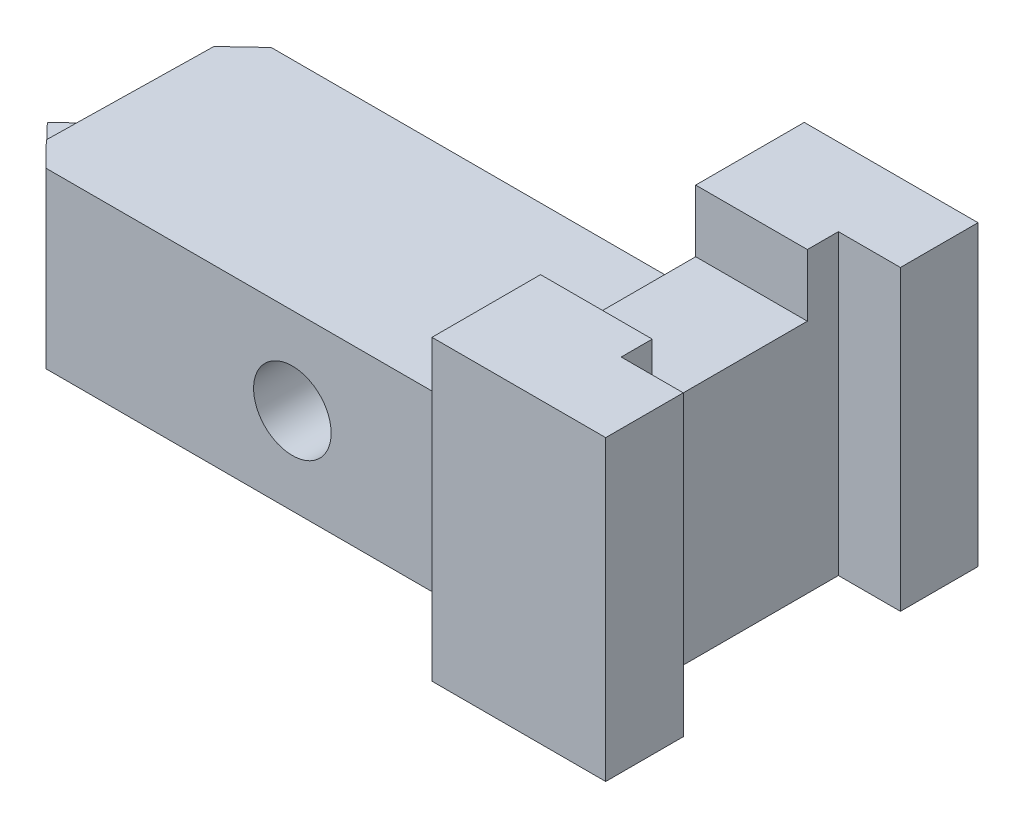
ISO-10303-21;
HEADER;
FILE_DESCRIPTION(('STEP AP214'),'2;1');
FILE_NAME('part.step','',(''),(''),'','','');
FILE_SCHEMA(('AUTOMOTIVE_DESIGN { 1 0 10303 214 1 1 1 1 }'));
ENDSEC;
DATA;
#1=APPLICATION_CONTEXT('core data for automotive mechanical design processes');
#2=APPLICATION_PROTOCOL_DEFINITION('international standard','automotive_design',2000,#1);
#3=PRODUCT_CONTEXT('',#1,'mechanical');
#4=PRODUCT('Part','Part','',(#3));
#5=PRODUCT_RELATED_PRODUCT_CATEGORY('part','',(#4));
#6=PRODUCT_DEFINITION_FORMATION('','',#4);
#7=PRODUCT_DEFINITION_CONTEXT('part definition',#1,'design');
#8=PRODUCT_DEFINITION('design','',#6,#7);
#9=PRODUCT_DEFINITION_SHAPE('','',#8);
#10=(LENGTH_UNIT() NAMED_UNIT(*) SI_UNIT(.MILLI.,.METRE.));
#11=(NAMED_UNIT(*) PLANE_ANGLE_UNIT() SI_UNIT($,.RADIAN.));
#12=(NAMED_UNIT(*) SI_UNIT($,.STERADIAN.) SOLID_ANGLE_UNIT());
#13=UNCERTAINTY_MEASURE_WITH_UNIT(LENGTH_MEASURE(1.E-05),#10,'distance_accuracy_value','');
#14=(GEOMETRIC_REPRESENTATION_CONTEXT(3) GLOBAL_UNCERTAINTY_ASSIGNED_CONTEXT((#13)) GLOBAL_UNIT_ASSIGNED_CONTEXT((#10,
#11,#12)) REPRESENTATION_CONTEXT('',''));
#15=CARTESIAN_POINT('',(0.,0.,0.));
#16=DIRECTION('',(0.,0.,1.));
#17=DIRECTION('',(1.,0.,0.));
#18=AXIS2_PLACEMENT_3D('',#15,#16,#17);
#19=CARTESIAN_POINT('',(0.,0.,60.));
#20=DIRECTION('',(1.,0.,0.));
#21=DIRECTION('',(0.,0.,-1.));
#22=AXIS2_PLACEMENT_3D('',#19,#20,#21);
#23=PLANE('',#22);
#24=DIRECTION('',(0.,-1.,0.));
#25=VECTOR('',#24,1.);
#26=CARTESIAN_POINT('',(0.,0.,12.5));
#27=LINE('',#26,#25);
#28=CARTESIAN_POINT('',(0.,28.,12.5));
#29=VERTEX_POINT('',#28);
#30=CARTESIAN_POINT('',(0.,0.,12.5));
#31=VERTEX_POINT('',#30);
#32=EDGE_CURVE('E225',#29,#31,#27,.T.);
#33=ORIENTED_EDGE('',*,*,#32,.F.);
#34=DIRECTION('',(0.,0.,-1.));
#35=VECTOR('',#34,1.);
#36=CARTESIAN_POINT('',(0.,28.,12.5));
#37=LINE('',#36,#35);
#38=CARTESIAN_POINT('',(0.,28.,47.5));
#39=VERTEX_POINT('',#38);
#40=EDGE_CURVE('E232',#39,#29,#37,.T.);
#41=ORIENTED_EDGE('',*,*,#40,.F.);
#42=DIRECTION('',(0.,1.,0.));
#43=VECTOR('',#42,1.);
#44=CARTESIAN_POINT('',(0.,0.,47.5));
#45=LINE('',#44,#43);
#46=CARTESIAN_POINT('',(0.,0.,47.5));
#47=VERTEX_POINT('',#46);
#48=EDGE_CURVE('E228',#47,#39,#45,.T.);
#49=ORIENTED_EDGE('',*,*,#48,.F.);
#50=DIRECTION('',(0.,0.,-1.));
#51=VECTOR('',#50,1.);
#52=CARTESIAN_POINT('',(0.,0.,60.));
#53=LINE('',#52,#51);
#54=CARTESIAN_POINT('',(0.,0.,60.));
#55=VERTEX_POINT('',#54);
#56=EDGE_CURVE('E354',#55,#47,#53,.T.);
#57=ORIENTED_EDGE('',*,*,#56,.F.);
#58=DIRECTION('',(0.,-1.,0.));
#59=VECTOR('',#58,1.);
#60=CARTESIAN_POINT('',(0.,0.,60.));
#61=LINE('',#60,#59);
#62=CARTESIAN_POINT('',(0.,48.,60.));
#63=VERTEX_POINT('',#62);
#64=EDGE_CURVE('E310',#63,#55,#61,.T.);
#65=ORIENTED_EDGE('',*,*,#64,.F.);
#66=DIRECTION('',(0.,0.,-1.));
#67=VECTOR('',#66,1.);
#68=CARTESIAN_POINT('',(0.,48.,60.));
#69=LINE('',#68,#67);
#70=CARTESIAN_POINT('',(0.,48.,42.5));
#71=VERTEX_POINT('',#70);
#72=EDGE_CURVE('E339',#63,#71,#69,.T.);
#73=ORIENTED_EDGE('',*,*,#72,.T.);
#74=DIRECTION('',(0.,1.,0.));
#75=VECTOR('',#74,1.);
#76=CARTESIAN_POINT('',(0.,48.,42.5));
#77=LINE('',#76,#75);
#78=CARTESIAN_POINT('',(0.,38.,42.5));
#79=VERTEX_POINT('',#78);
#80=EDGE_CURVE('E255',#79,#71,#77,.T.);
#81=ORIENTED_EDGE('',*,*,#80,.F.);
#82=DIRECTION('',(0.,0.,1.));
#83=VECTOR('',#82,1.);
#84=CARTESIAN_POINT('',(0.,38.,17.5));
#85=LINE('',#84,#83);
#86=CARTESIAN_POINT('',(0.,38.,17.5));
#87=VERTEX_POINT('',#86);
#88=EDGE_CURVE('E251',#87,#79,#85,.T.);
#89=ORIENTED_EDGE('',*,*,#88,.F.);
#90=DIRECTION('',(0.,-1.,0.));
#91=VECTOR('',#90,1.);
#92=CARTESIAN_POINT('',(0.,48.,17.5));
#93=LINE('',#92,#91);
#94=CARTESIAN_POINT('',(0.,48.,17.5));
#95=VERTEX_POINT('',#94);
#96=EDGE_CURVE('E247',#95,#87,#93,.T.);
#97=ORIENTED_EDGE('',*,*,#96,.F.);
#98=CARTESIAN_POINT('',(0.,48.,0.));
#99=VERTEX_POINT('',#98);
#100=EDGE_CURVE('E324',#95,#99,#69,.T.);
#101=ORIENTED_EDGE('',*,*,#100,.T.);
#102=DIRECTION('',(0.,-1.,0.));
#103=VECTOR('',#102,1.);
#104=CARTESIAN_POINT('',(0.,0.,0.));
#105=LINE('',#104,#103);
#106=CARTESIAN_POINT('',(0.,0.,0.));
#107=VERTEX_POINT('',#106);
#108=EDGE_CURVE('E300',#99,#107,#105,.T.);
#109=ORIENTED_EDGE('',*,*,#108,.T.);
#110=EDGE_CURVE('E353',#31,#107,#53,.T.);
#111=ORIENTED_EDGE('',*,*,#110,.F.);
#112=EDGE_LOOP('',(#33,#41,#49,#57,#65,#73,#81,#89,#97,#101,#109,#111));
#113=FACE_BOUND('',#112,.T.);
#114=ADVANCED_FACE('F41',(#113),#23,.F.);
#115=CARTESIAN_POINT('',(0.,48.,60.));
#116=DIRECTION('',(0.,-1.,0.));
#117=DIRECTION('',(0.,0.,-1.));
#118=AXIS2_PLACEMENT_3D('',#115,#116,#117);
#119=PLANE('',#118);
#120=ORIENTED_EDGE('',*,*,#100,.F.);
#121=DIRECTION('',(-1.,0.,0.));
#122=VECTOR('',#121,1.);
#123=CARTESIAN_POINT('',(48.,48.,17.5));
#124=LINE('',#123,#122);
#125=CARTESIAN_POINT('',(18.,48.,17.5));
#126=VERTEX_POINT('',#125);
#127=EDGE_CURVE('E259',#126,#95,#124,.T.);
#128=ORIENTED_EDGE('',*,*,#127,.F.);
#129=DIRECTION('',(0.,0.,1.));
#130=VECTOR('',#129,1.);
#131=CARTESIAN_POINT('',(18.,48.,12.5));
#132=LINE('',#131,#130);
#133=CARTESIAN_POINT('',(18.,48.,12.5));
#134=VERTEX_POINT('',#133);
#135=EDGE_CURVE('E290',#134,#126,#132,.T.);
#136=ORIENTED_EDGE('',*,*,#135,.F.);
#137=DIRECTION('',(-1.,0.,0.));
#138=VECTOR('',#137,1.);
#139=CARTESIAN_POINT('',(28.,48.,12.5));
#140=LINE('',#139,#138);
#141=CARTESIAN_POINT('',(28.,48.,12.5));
#142=VERTEX_POINT('',#141);
#143=EDGE_CURVE('E262',#142,#134,#140,.T.);
#144=ORIENTED_EDGE('',*,*,#143,.F.);
#145=DIRECTION('',(0.,0.,-1.));
#146=VECTOR('',#145,1.);
#147=CARTESIAN_POINT('',(28.,48.,60.));
#148=LINE('',#147,#146);
#149=CARTESIAN_POINT('',(28.,48.,0.));
#150=VERTEX_POINT('',#149);
#151=EDGE_CURVE('E343',#142,#150,#148,.T.);
#152=ORIENTED_EDGE('',*,*,#151,.T.);
#153=DIRECTION('',(-1.,0.,0.));
#154=VECTOR('',#153,1.);
#155=CARTESIAN_POINT('',(0.,48.,0.));
#156=LINE('',#155,#154);
#157=EDGE_CURVE('E315',#150,#99,#156,.T.);
#158=ORIENTED_EDGE('',*,*,#157,.T.);
#159=EDGE_LOOP('',(#120,#128,#136,#144,#152,#158));
#160=FACE_BOUND('',#159,.T.);
#161=ADVANCED_FACE('F377',(#160),#119,.F.);
#162=CARTESIAN_POINT('',(28.,0.,60.));
#163=DIRECTION('',(-1.,0.,0.));
#164=DIRECTION('',(0.,0.,1.));
#165=AXIS2_PLACEMENT_3D('',#162,#163,#164);
#166=PLANE('',#165);
#167=DIRECTION('',(0.,0.,-1.));
#168=VECTOR('',#167,1.);
#169=CARTESIAN_POINT('',(28.,0.,60.));
#170=LINE('',#169,#168);
#171=CARTESIAN_POINT('',(28.,0.,60.));
#172=VERTEX_POINT('',#171);
#173=CARTESIAN_POINT('',(28.,0.,47.5));
#174=VERTEX_POINT('',#173);
#175=EDGE_CURVE('E349',#172,#174,#170,.T.);
#176=ORIENTED_EDGE('',*,*,#175,.T.);
#177=DIRECTION('',(0.,1.,0.));
#178=VECTOR('',#177,1.);
#179=CARTESIAN_POINT('',(28.,0.,47.5));
#180=LINE('',#179,#178);
#181=CARTESIAN_POINT('',(28.,48.,47.5));
#182=VERTEX_POINT('',#181);
#183=EDGE_CURVE('E296',#174,#182,#180,.T.);
#184=ORIENTED_EDGE('',*,*,#183,.T.);
#185=CARTESIAN_POINT('',(28.,48.,60.));
#186=VERTEX_POINT('',#185);
#187=EDGE_CURVE('E344',#186,#182,#148,.T.);
#188=ORIENTED_EDGE('',*,*,#187,.F.);
#189=DIRECTION('',(0.,1.,0.));
#190=VECTOR('',#189,1.);
#191=CARTESIAN_POINT('',(28.,0.,60.));
#192=LINE('',#191,#190);
#193=EDGE_CURVE('E318',#172,#186,#192,.T.);
#194=ORIENTED_EDGE('',*,*,#193,.F.);
#195=EDGE_LOOP('',(#176,#184,#188,#194));
#196=FACE_BOUND('',#195,.T.);
#197=ADVANCED_FACE('F399',(#196),#166,.F.);
#198=CARTESIAN_POINT('',(0.,0.,60.));
#199=DIRECTION('',(0.,1.,0.));
#200=DIRECTION('',(0.,0.,1.));
#201=AXIS2_PLACEMENT_3D('',#198,#199,#200);
#202=PLANE('',#201);
#203=DIRECTION('',(1.,0.,0.));
#204=VECTOR('',#203,1.);
#205=CARTESIAN_POINT('',(-92.,0.,47.5));
#206=LINE('',#205,#204);
#207=CARTESIAN_POINT('',(-74.7053829977631,0.,47.5));
#208=VERTEX_POINT('',#207);
#209=EDGE_CURVE('E241',#208,#47,#206,.T.);
#210=ORIENTED_EDGE('',*,*,#209,.F.);
#211=DIRECTION('',(-0.702920679963167,0.,-0.711268245938281));
#212=VECTOR('',#211,1.);
#213=CARTESIAN_POINT('',(-31.5440768544366,0.,91.173870164949));
#214=LINE('',#213,#212);
#215=CARTESIAN_POINT('',(-92.,0.,30.));
#216=VERTEX_POINT('',#215);
#217=EDGE_CURVE('E203',#208,#216,#214,.T.);
#218=ORIENTED_EDGE('',*,*,#217,.T.);
#219=DIRECTION('',(0.728159504377198,0.,-0.685407715294447));
#220=VECTOR('',#219,1.);
#221=CARTESIAN_POINT('',(-58.1926879969875,0.,-1.8224130028357));
#222=LINE('',#221,#220);
#223=CARTESIAN_POINT('',(-73.4084507042254,0.,12.5));
#224=VERTEX_POINT('',#223);
#225=EDGE_CURVE('E213',#216,#224,#222,.T.);
#226=ORIENTED_EDGE('',*,*,#225,.T.);
#227=DIRECTION('',(1.,0.,0.));
#228=VECTOR('',#227,1.);
#229=CARTESIAN_POINT('',(-92.,0.,12.5));
#230=LINE('',#229,#228);
#231=EDGE_CURVE('E244',#224,#31,#230,.T.);
#232=ORIENTED_EDGE('',*,*,#231,.T.);
#233=ORIENTED_EDGE('',*,*,#110,.T.);
#234=DIRECTION('',(1.,0.,0.));
#235=VECTOR('',#234,1.);
#236=CARTESIAN_POINT('',(0.,0.,0.));
#237=LINE('',#236,#235);
#238=CARTESIAN_POINT('',(28.,0.,0.));
#239=VERTEX_POINT('',#238);
#240=EDGE_CURVE('E328',#107,#239,#237,.T.);
#241=ORIENTED_EDGE('',*,*,#240,.T.);
#242=CARTESIAN_POINT('',(28.,0.,12.5));
#243=VERTEX_POINT('',#242);
#244=EDGE_CURVE('E348',#243,#239,#170,.T.);
#245=ORIENTED_EDGE('',*,*,#244,.F.);
#246=DIRECTION('',(-1.,0.,0.));
#247=VECTOR('',#246,1.);
#248=CARTESIAN_POINT('',(28.,0.,12.5));
#249=LINE('',#248,#247);
#250=CARTESIAN_POINT('',(18.,0.,12.5));
#251=VERTEX_POINT('',#250);
#252=EDGE_CURVE('E272',#243,#251,#249,.T.);
#253=ORIENTED_EDGE('',*,*,#252,.T.);
#254=DIRECTION('',(0.,0.,1.));
#255=VECTOR('',#254,1.);
#256=CARTESIAN_POINT('',(18.,0.,12.5));
#257=LINE('',#256,#255);
#258=CARTESIAN_POINT('',(18.,0.,47.5));
#259=VERTEX_POINT('',#258);
#260=EDGE_CURVE('E276',#251,#259,#257,.T.);
#261=ORIENTED_EDGE('',*,*,#260,.T.);
#262=DIRECTION('',(1.,0.,0.));
#263=VECTOR('',#262,1.);
#264=CARTESIAN_POINT('',(28.,0.,47.5));
#265=LINE('',#264,#263);
#266=EDGE_CURVE('E281',#259,#174,#265,.T.);
#267=ORIENTED_EDGE('',*,*,#266,.T.);
#268=ORIENTED_EDGE('',*,*,#175,.F.);
#269=DIRECTION('',(1.,0.,0.));
#270=VECTOR('',#269,1.);
#271=CARTESIAN_POINT('',(0.,0.,60.));
#272=LINE('',#271,#270);
#273=EDGE_CURVE('E314',#55,#172,#272,.T.);
#274=ORIENTED_EDGE('',*,*,#273,.F.);
#275=ORIENTED_EDGE('',*,*,#56,.T.);
#276=EDGE_LOOP('',(#210,#218,#226,#232,#233,#241,#245,#253,#261,#267,#268,#274,#275));
#277=FACE_BOUND('',#276,.T.);
#278=ADVANCED_FACE('F403',(#277),#202,.F.);
#279=ORIENTED_EDGE('',*,*,#151,.F.);
#280=DIRECTION('',(0.,1.,0.));
#281=VECTOR('',#280,1.);
#282=CARTESIAN_POINT('',(28.,0.,12.5));
#283=LINE('',#282,#281);
#284=EDGE_CURVE('E285',#243,#142,#283,.T.);
#285=ORIENTED_EDGE('',*,*,#284,.F.);
#286=ORIENTED_EDGE('',*,*,#244,.T.);
#287=DIRECTION('',(0.,1.,0.));
#288=VECTOR('',#287,1.);
#289=CARTESIAN_POINT('',(28.,0.,0.));
#290=LINE('',#289,#288);
#291=EDGE_CURVE('E332',#239,#150,#290,.T.);
#292=ORIENTED_EDGE('',*,*,#291,.T.);
#293=EDGE_LOOP('',(#279,#285,#286,#292));
#294=FACE_BOUND('',#293,.T.);
#295=ADVANCED_FACE('F410',(#294),#166,.F.);
#296=CARTESIAN_POINT('',(18.,48.,42.5));
#297=VERTEX_POINT('',#296);
#298=CARTESIAN_POINT('',(18.,48.,47.5));
#299=VERTEX_POINT('',#298);
#300=EDGE_CURVE('E289',#297,#299,#132,.T.);
#301=ORIENTED_EDGE('',*,*,#300,.F.);
#302=DIRECTION('',(-1.,0.,0.));
#303=VECTOR('',#302,1.);
#304=CARTESIAN_POINT('',(48.,48.,42.5));
#305=LINE('',#304,#303);
#306=EDGE_CURVE('E263',#297,#71,#305,.T.);
#307=ORIENTED_EDGE('',*,*,#306,.T.);
#308=ORIENTED_EDGE('',*,*,#72,.F.);
#309=DIRECTION('',(-1.,0.,0.));
#310=VECTOR('',#309,1.);
#311=CARTESIAN_POINT('',(0.,48.,60.));
#312=LINE('',#311,#310);
#313=EDGE_CURVE('E321',#186,#63,#312,.T.);
#314=ORIENTED_EDGE('',*,*,#313,.F.);
#315=ORIENTED_EDGE('',*,*,#187,.T.);
#316=DIRECTION('',(1.,0.,0.));
#317=VECTOR('',#316,1.);
#318=CARTESIAN_POINT('',(28.,48.,47.5));
#319=LINE('',#318,#317);
#320=EDGE_CURVE('E277',#299,#182,#319,.T.);
#321=ORIENTED_EDGE('',*,*,#320,.F.);
#322=EDGE_LOOP('',(#301,#307,#308,#314,#315,#321));
#323=FACE_BOUND('',#322,.T.);
#324=ADVANCED_FACE('F393',(#323),#119,.F.);
#325=CARTESIAN_POINT('',(0.,0.,60.));
#326=DIRECTION('',(0.,0.,-1.));
#327=DIRECTION('',(-1.,0.,0.));
#328=AXIS2_PLACEMENT_3D('',#325,#326,#327);
#329=PLANE('',#328);
#330=ORIENTED_EDGE('',*,*,#64,.T.);
#331=ORIENTED_EDGE('',*,*,#273,.T.);
#332=ORIENTED_EDGE('',*,*,#193,.T.);
#333=ORIENTED_EDGE('',*,*,#313,.T.);
#334=EDGE_LOOP('',(#330,#331,#332,#333));
#335=FACE_BOUND('',#334,.T.);
#336=ADVANCED_FACE('F431',(#335),#329,.F.);
#337=CARTESIAN_POINT('',(0.,0.,0.));
#338=DIRECTION('',(0.,0.,-1.));
#339=DIRECTION('',(-1.,0.,0.));
#340=AXIS2_PLACEMENT_3D('',#337,#338,#339);
#341=PLANE('',#340);
#342=ORIENTED_EDGE('',*,*,#108,.F.);
#343=ORIENTED_EDGE('',*,*,#157,.F.);
#344=ORIENTED_EDGE('',*,*,#291,.F.);
#345=ORIENTED_EDGE('',*,*,#240,.F.);
#346=EDGE_LOOP('',(#342,#343,#344,#345));
#347=FACE_BOUND('',#346,.T.);
#348=ADVANCED_FACE('F418',(#347),#341,.T.);
#349=CARTESIAN_POINT('',(28.,0.,47.5));
#350=DIRECTION('',(0.,0.,1.));
#351=DIRECTION('',(1.,0.,0.));
#352=AXIS2_PLACEMENT_3D('',#349,#350,#351);
#353=PLANE('',#352);
#354=ORIENTED_EDGE('',*,*,#320,.T.);
#355=ORIENTED_EDGE('',*,*,#183,.F.);
#356=ORIENTED_EDGE('',*,*,#266,.F.);
#357=DIRECTION('',(0.,1.,0.));
#358=VECTOR('',#357,1.);
#359=CARTESIAN_POINT('',(18.,0.,47.5));
#360=LINE('',#359,#358);
#361=EDGE_CURVE('E301',#259,#299,#360,.T.);
#362=ORIENTED_EDGE('',*,*,#361,.T.);
#363=EDGE_LOOP('',(#354,#355,#356,#362));
#364=FACE_BOUND('',#363,.T.);
#365=ADVANCED_FACE('F392',(#364),#353,.F.);
#366=CARTESIAN_POINT('',(18.,0.,12.5));
#367=DIRECTION('',(-1.,0.,0.));
#368=DIRECTION('',(0.,0.,1.));
#369=AXIS2_PLACEMENT_3D('',#366,#367,#368);
#370=PLANE('',#369);
#371=ORIENTED_EDGE('',*,*,#135,.T.);
#372=DIRECTION('',(0.,-1.,0.));
#373=VECTOR('',#372,1.);
#374=CARTESIAN_POINT('',(18.,0.,17.5));
#375=LINE('',#374,#373);
#376=CARTESIAN_POINT('',(18.,38.,17.5));
#377=VERTEX_POINT('',#376);
#378=EDGE_CURVE('E49',#126,#377,#375,.T.);
#379=ORIENTED_EDGE('',*,*,#378,.T.);
#380=DIRECTION('',(0.,0.,1.));
#381=VECTOR('',#380,1.);
#382=CARTESIAN_POINT('',(18.,38.,12.5));
#383=LINE('',#382,#381);
#384=CARTESIAN_POINT('',(18.,38.,42.5));
#385=VERTEX_POINT('',#384);
#386=EDGE_CURVE('E358',#377,#385,#383,.T.);
#387=ORIENTED_EDGE('',*,*,#386,.T.);
#388=DIRECTION('',(0.,1.,0.));
#389=VECTOR('',#388,1.);
#390=CARTESIAN_POINT('',(18.,0.,42.5));
#391=LINE('',#390,#389);
#392=EDGE_CURVE('E362',#385,#297,#391,.T.);
#393=ORIENTED_EDGE('',*,*,#392,.T.);
#394=ORIENTED_EDGE('',*,*,#300,.T.);
#395=ORIENTED_EDGE('',*,*,#361,.F.);
#396=ORIENTED_EDGE('',*,*,#260,.F.);
#397=DIRECTION('',(0.,1.,0.));
#398=VECTOR('',#397,1.);
#399=CARTESIAN_POINT('',(18.,0.,12.5));
#400=LINE('',#399,#398);
#401=EDGE_CURVE('E305',#251,#134,#400,.T.);
#402=ORIENTED_EDGE('',*,*,#401,.T.);
#403=EDGE_LOOP('',(#371,#379,#387,#393,#394,#395,#396,#402));
#404=FACE_BOUND('',#403,.T.);
#405=ADVANCED_FACE('F368',(#404),#370,.F.);
#406=CARTESIAN_POINT('',(28.,0.,12.5));
#407=DIRECTION('',(0.,0.,-1.));
#408=DIRECTION('',(-1.,0.,0.));
#409=AXIS2_PLACEMENT_3D('',#406,#407,#408);
#410=PLANE('',#409);
#411=ORIENTED_EDGE('',*,*,#143,.T.);
#412=ORIENTED_EDGE('',*,*,#401,.F.);
#413=ORIENTED_EDGE('',*,*,#252,.F.);
#414=ORIENTED_EDGE('',*,*,#284,.T.);
#415=EDGE_LOOP('',(#411,#412,#413,#414));
#416=FACE_BOUND('',#415,.T.);
#417=ADVANCED_FACE('F406',(#416),#410,.F.);
#418=CARTESIAN_POINT('',(48.,48.,17.5));
#419=DIRECTION('',(0.,0.,-1.));
#420=DIRECTION('',(0.,1.,0.));
#421=AXIS2_PLACEMENT_3D('',#418,#419,#420);
#422=PLANE('',#421);
#423=ORIENTED_EDGE('',*,*,#127,.T.);
#424=ORIENTED_EDGE('',*,*,#96,.T.);
#425=DIRECTION('',(-1.,0.,0.));
#426=VECTOR('',#425,1.);
#427=CARTESIAN_POINT('',(48.,38.,17.5));
#428=LINE('',#427,#426);
#429=EDGE_CURVE('E258',#377,#87,#428,.T.);
#430=ORIENTED_EDGE('',*,*,#429,.F.);
#431=ORIENTED_EDGE('',*,*,#378,.F.);
#432=EDGE_LOOP('',(#423,#424,#430,#431));
#433=FACE_BOUND('',#432,.T.);
#434=ADVANCED_FACE('F373',(#433),#422,.F.);
#435=CARTESIAN_POINT('',(48.,48.,42.5));
#436=DIRECTION('',(0.,0.,1.));
#437=DIRECTION('',(1.,0.,0.));
#438=AXIS2_PLACEMENT_3D('',#435,#436,#437);
#439=PLANE('',#438);
#440=DIRECTION('',(-1.,0.,0.));
#441=VECTOR('',#440,1.);
#442=CARTESIAN_POINT('',(48.,38.,42.5));
#443=LINE('',#442,#441);
#444=EDGE_CURVE('E267',#385,#79,#443,.T.);
#445=ORIENTED_EDGE('',*,*,#444,.T.);
#446=ORIENTED_EDGE('',*,*,#80,.T.);
#447=ORIENTED_EDGE('',*,*,#306,.F.);
#448=ORIENTED_EDGE('',*,*,#392,.F.);
#449=EDGE_LOOP('',(#445,#446,#447,#448));
#450=FACE_BOUND('',#449,.T.);
#451=ADVANCED_FACE('F501',(#450),#439,.F.);
#452=CARTESIAN_POINT('',(48.,38.,17.5));
#453=DIRECTION('',(0.,-1.,0.));
#454=DIRECTION('',(0.,0.,-1.));
#455=AXIS2_PLACEMENT_3D('',#452,#453,#454);
#456=PLANE('',#455);
#457=ORIENTED_EDGE('',*,*,#429,.T.);
#458=ORIENTED_EDGE('',*,*,#88,.T.);
#459=ORIENTED_EDGE('',*,*,#444,.F.);
#460=ORIENTED_EDGE('',*,*,#386,.F.);
#461=EDGE_LOOP('',(#457,#458,#459,#460));
#462=FACE_BOUND('',#461,.T.);
#463=ADVANCED_FACE('F510',(#462),#456,.F.);
#464=CARTESIAN_POINT('',(-92.,0.,12.5));
#465=DIRECTION('',(0.,0.,1.));
#466=DIRECTION('',(0.,-1.,0.));
#467=AXIS2_PLACEMENT_3D('',#464,#465,#466);
#468=PLANE('',#467);
#469=CARTESIAN_POINT('',(-35.,14.,12.5));
#470=DIRECTION('',(0.,0.,1.));
#471=DIRECTION('',(0.,-1.,0.));
#472=AXIS2_PLACEMENT_3D('',#469,#470,#471);
#473=CIRCLE('',#472,6.25);
#474=CARTESIAN_POINT('',(-35.,7.75,12.5));
#475=VERTEX_POINT('',#474);
#476=EDGE_CURVE('E221',#475,#475,#473,.T.);
#477=ORIENTED_EDGE('',*,*,#476,.T.);
#478=EDGE_LOOP('',(#477));
#479=FACE_BOUND('',#478,.T.);
#480=ORIENTED_EDGE('',*,*,#231,.F.);
#481=DIRECTION('',(0.,1.,0.));
#482=VECTOR('',#481,1.);
#483=CARTESIAN_POINT('',(-73.4084507042254,-31.,12.5));
#484=LINE('',#483,#482);
#485=CARTESIAN_POINT('',(-73.4084507042254,28.,12.5));
#486=VERTEX_POINT('',#485);
#487=EDGE_CURVE('E210',#224,#486,#484,.T.);
#488=ORIENTED_EDGE('',*,*,#487,.T.);
#489=DIRECTION('',(1.,0.,0.));
#490=VECTOR('',#489,1.);
#491=CARTESIAN_POINT('',(-92.,28.,12.5));
#492=LINE('',#491,#490);
#493=EDGE_CURVE('E64',#486,#29,#492,.T.);
#494=ORIENTED_EDGE('',*,*,#493,.T.);
#495=ORIENTED_EDGE('',*,*,#32,.T.);
#496=EDGE_LOOP('',(#480,#488,#494,#495));
#497=FACE_BOUND('',#496,.T.);
#498=ADVANCED_FACE('F519',(#479,#497),#468,.F.);
#499=CARTESIAN_POINT('',(-92.,0.,47.5));
#500=DIRECTION('',(0.,0.,-1.));
#501=DIRECTION('',(-1.,0.,0.));
#502=AXIS2_PLACEMENT_3D('',#499,#500,#501);
#503=PLANE('',#502);
#504=CARTESIAN_POINT('',(-35.,14.,47.5));
#505=DIRECTION('',(0.,0.,1.));
#506=DIRECTION('',(1.,0.,0.));
#507=AXIS2_PLACEMENT_3D('',#504,#505,#506);
#508=CIRCLE('',#507,6.25);
#509=CARTESIAN_POINT('',(-28.75,14.,47.5));
#510=VERTEX_POINT('',#509);
#511=EDGE_CURVE('E217',#510,#510,#508,.T.);
#512=ORIENTED_EDGE('',*,*,#511,.F.);
#513=EDGE_LOOP('',(#512));
#514=FACE_BOUND('',#513,.T.);
#515=DIRECTION('',(1.,0.,0.));
#516=VECTOR('',#515,1.);
#517=CARTESIAN_POINT('',(-92.,28.,47.5));
#518=LINE('',#517,#516);
#519=CARTESIAN_POINT('',(-74.7053829977631,28.,47.5));
#520=VERTEX_POINT('',#519);
#521=EDGE_CURVE('E238',#520,#39,#518,.T.);
#522=ORIENTED_EDGE('',*,*,#521,.F.);
#523=DIRECTION('',(0.,1.,0.));
#524=VECTOR('',#523,1.);
#525=CARTESIAN_POINT('',(-74.7053829977631,-31.,47.5));
#526=LINE('',#525,#524);
#527=EDGE_CURVE('E200',#208,#520,#526,.T.);
#528=ORIENTED_EDGE('',*,*,#527,.F.);
#529=ORIENTED_EDGE('',*,*,#209,.T.);
#530=ORIENTED_EDGE('',*,*,#48,.T.);
#531=EDGE_LOOP('',(#522,#528,#529,#530));
#532=FACE_BOUND('',#531,.T.);
#533=ADVANCED_FACE('F548',(#514,#532),#503,.F.);
#534=CARTESIAN_POINT('',(-92.,28.,12.5));
#535=DIRECTION('',(0.,-1.,0.));
#536=DIRECTION('',(0.,0.,-1.));
#537=AXIS2_PLACEMENT_3D('',#534,#535,#536);
#538=PLANE('',#537);
#539=DIRECTION('',(0.728159504377198,0.,-0.685407715294447));
#540=VECTOR('',#539,1.);
#541=CARTESIAN_POINT('',(-92.,28.,30.));
#542=LINE('',#541,#540);
#543=CARTESIAN_POINT('',(-78.1649694168332,28.,16.9772534094055));
#544=VERTEX_POINT('',#543);
#545=EDGE_CURVE('E207',#544,#486,#542,.T.);
#546=ORIENTED_EDGE('',*,*,#545,.F.);
#547=DIRECTION('',(0.0180676873380558,0.,-0.99983676601446));
#548=VECTOR('',#547,1.);
#549=CARTESIAN_POINT('',(-78.6445070806998,28.,43.5140966728273));
#550=LINE('',#549,#548);
#551=CARTESIAN_POINT('',(-78.6445070806998,28.,43.5140966728273));
#552=VERTEX_POINT('',#551);
#553=EDGE_CURVE('E608',#552,#544,#550,.T.);
#554=ORIENTED_EDGE('',*,*,#553,.F.);
#555=DIRECTION('',(-0.702920679963167,0.,-0.711268245938281));
#556=VECTOR('',#555,1.);
#557=CARTESIAN_POINT('',(-74.7053829977631,28.,47.5));
#558=LINE('',#557,#556);
#559=EDGE_CURVE('E191',#520,#552,#558,.T.);
#560=ORIENTED_EDGE('',*,*,#559,.F.);
#561=ORIENTED_EDGE('',*,*,#521,.T.);
#562=ORIENTED_EDGE('',*,*,#40,.T.);
#563=ORIENTED_EDGE('',*,*,#493,.F.);
#564=EDGE_LOOP('',(#546,#554,#560,#561,#562,#563));
#565=FACE_BOUND('',#564,.T.);
#566=ADVANCED_FACE('F536',(#565),#538,.F.);
#567=CARTESIAN_POINT('',(-35.,14.,-11.5));
#568=DIRECTION('',(0.,0.,1.));
#569=DIRECTION('',(1.,0.,0.));
#570=AXIS2_PLACEMENT_3D('',#567,#568,#569);
#571=CYLINDRICAL_SURFACE('',#570,6.25);
#572=ORIENTED_EDGE('',*,*,#511,.T.);
#573=EDGE_LOOP('',(#572));
#574=FACE_BOUND('',#573,.T.);
#575=ORIENTED_EDGE('',*,*,#476,.F.);
#576=EDGE_LOOP('',(#575));
#577=FACE_BOUND('',#576,.T.);
#578=ADVANCED_FACE('F531',(#574,#577),#571,.F.);
#579=CARTESIAN_POINT('',(-92.,-31.,30.));
#580=DIRECTION('',(0.685407715294447,0.,0.728159504377198));
#581=DIRECTION('',(0.728159504377198,0.,-0.685407715294447));
#582=AXIS2_PLACEMENT_3D('',#579,#580,#581);
#583=PLANE('',#582);
#584=DIRECTION('',(-0.728159504377198,0.,0.685407715294447));
#585=VECTOR('',#584,1.);
#586=CARTESIAN_POINT('',(-92.,17.,30.));
#587=LINE('',#586,#585);
#588=CARTESIAN_POINT('',(-78.1649694168332,17.,16.9772534094055));
#589=VERTEX_POINT('',#588);
#590=CARTESIAN_POINT('',(-92.,17.,30.));
#591=VERTEX_POINT('',#590);
#592=EDGE_CURVE('E56',#589,#591,#587,.T.);
#593=ORIENTED_EDGE('',*,*,#592,.F.);
#594=DIRECTION('',(0.,1.,0.));
#595=VECTOR('',#594,1.);
#596=CARTESIAN_POINT('',(-78.1649694168332,17.,16.9772534094055));
#597=LINE('',#596,#595);
#598=EDGE_CURVE('E185',#589,#544,#597,.T.);
#599=ORIENTED_EDGE('',*,*,#598,.T.);
#600=ORIENTED_EDGE('',*,*,#545,.T.);
#601=ORIENTED_EDGE('',*,*,#487,.F.);
#602=ORIENTED_EDGE('',*,*,#225,.F.);
#603=DIRECTION('',(0.,-1.,0.));
#604=VECTOR('',#603,1.);
#605=CARTESIAN_POINT('',(-92.,0.,30.));
#606=LINE('',#605,#604);
#607=EDGE_CURVE('E11',#591,#216,#606,.T.);
#608=ORIENTED_EDGE('',*,*,#607,.F.);
#609=EDGE_LOOP('',(#593,#599,#600,#601,#602,#608));
#610=FACE_BOUND('',#609,.T.);
#611=ADVANCED_FACE('F535',(#610),#583,.F.);
#612=CARTESIAN_POINT('',(-74.7053829977631,-31.,47.5));
#613=DIRECTION('',(0.711268245938281,0.,-0.702920679963167));
#614=DIRECTION('',(-0.702920679963167,0.,-0.711268245938281));
#615=AXIS2_PLACEMENT_3D('',#612,#613,#614);
#616=PLANE('',#615);
#617=ORIENTED_EDGE('',*,*,#559,.T.);
#618=DIRECTION('',(0.,1.,0.));
#619=VECTOR('',#618,1.);
#620=CARTESIAN_POINT('',(-78.6445070806998,17.,43.5140966728273));
#621=LINE('',#620,#619);
#622=CARTESIAN_POINT('',(-78.6445070806998,17.,43.5140966728273));
#623=VERTEX_POINT('',#622);
#624=EDGE_CURVE('E182',#623,#552,#621,.T.);
#625=ORIENTED_EDGE('',*,*,#624,.F.);
#626=DIRECTION('',(0.702920679963167,0.,0.711268245938281));
#627=VECTOR('',#626,1.);
#628=CARTESIAN_POINT('',(-92.,17.,30.));
#629=LINE('',#628,#627);
#630=EDGE_CURVE('E171',#591,#623,#629,.T.);
#631=ORIENTED_EDGE('',*,*,#630,.F.);
#632=ORIENTED_EDGE('',*,*,#607,.T.);
#633=ORIENTED_EDGE('',*,*,#217,.F.);
#634=ORIENTED_EDGE('',*,*,#527,.T.);
#635=EDGE_LOOP('',(#617,#625,#631,#632,#633,#634));
#636=FACE_BOUND('',#635,.T.);
#637=ADVANCED_FACE('F189',(#636),#616,.F.);
#638=CARTESIAN_POINT('',(-78.6445070806998,17.,43.5140966728273));
#639=DIRECTION('',(0.99983676601446,0.,0.0180676873380558));
#640=DIRECTION('',(0.0180676873380558,0.,-0.99983676601446));
#641=AXIS2_PLACEMENT_3D('',#638,#639,#640);
#642=PLANE('',#641);
#643=ORIENTED_EDGE('',*,*,#553,.T.);
#644=ORIENTED_EDGE('',*,*,#598,.F.);
#645=DIRECTION('',(0.0180676873380558,0.,-0.99983676601446));
#646=VECTOR('',#645,1.);
#647=CARTESIAN_POINT('',(-78.6445070806998,17.,43.5140966728273));
#648=LINE('',#647,#646);
#649=EDGE_CURVE('E174',#623,#589,#648,.T.);
#650=ORIENTED_EDGE('',*,*,#649,.F.);
#651=ORIENTED_EDGE('',*,*,#624,.T.);
#652=EDGE_LOOP('',(#643,#644,#650,#651));
#653=FACE_BOUND('',#652,.T.);
#654=ADVANCED_FACE('F181',(#653),#642,.F.);
#655=CARTESIAN_POINT('',(0.,17.,0.));
#656=DIRECTION('',(0.,-1.,0.));
#657=DIRECTION('',(0.,0.,-1.));
#658=AXIS2_PLACEMENT_3D('',#655,#656,#657);
#659=PLANE('',#658);
#660=ORIENTED_EDGE('',*,*,#592,.T.);
#661=ORIENTED_EDGE('',*,*,#630,.T.);
#662=ORIENTED_EDGE('',*,*,#649,.T.);
#663=EDGE_LOOP('',(#660,#661,#662));
#664=FACE_BOUND('',#663,.T.);
#665=ADVANCED_FACE('F173',(#664),#659,.F.);
#666=CLOSED_SHELL('',(#114,#161,#197,#278,#295,#324,#336,#348,#365,#405,#417,#434,#451,#463,
#498,#533,#566,#578,#611,#637,#654,#665));
#667=MANIFOLD_SOLID_BREP('B2',#666);
#668=ADVANCED_BREP_SHAPE_REPRESENTATION('',(#18,#667),#14);
#669=SHAPE_DEFINITION_REPRESENTATION(#9,#668);
ENDSEC;
END-ISO-10303-21;
